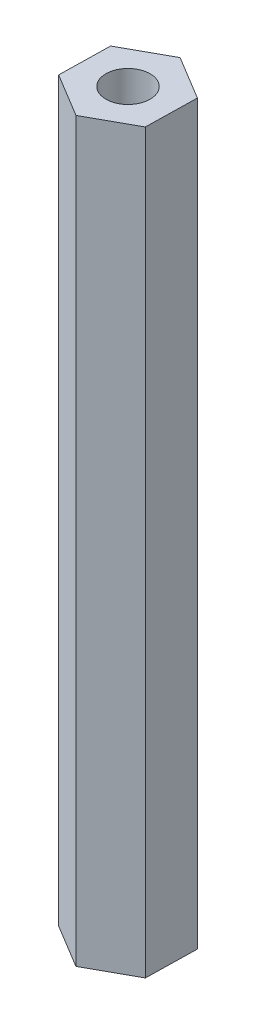
ISO-10303-21;
HEADER;
FILE_DESCRIPTION(('STEP AP214'),'2;1');
FILE_NAME('part.step','',(''),(''),'','','');
FILE_SCHEMA(('AUTOMOTIVE_DESIGN { 1 0 10303 214 1 1 1 1 }'));
ENDSEC;
DATA;
#1=APPLICATION_CONTEXT('core data for automotive mechanical design processes');
#2=APPLICATION_PROTOCOL_DEFINITION('international standard','automotive_design',2000,#1);
#3=PRODUCT_CONTEXT('',#1,'mechanical');
#4=PRODUCT('Part','Part','',(#3));
#5=PRODUCT_RELATED_PRODUCT_CATEGORY('part','',(#4));
#6=PRODUCT_DEFINITION_FORMATION('','',#4);
#7=PRODUCT_DEFINITION_CONTEXT('part definition',#1,'design');
#8=PRODUCT_DEFINITION('design','',#6,#7);
#9=PRODUCT_DEFINITION_SHAPE('','',#8);
#10=(LENGTH_UNIT() NAMED_UNIT(*) SI_UNIT(.MILLI.,.METRE.));
#11=(NAMED_UNIT(*) PLANE_ANGLE_UNIT() SI_UNIT($,.RADIAN.));
#12=(NAMED_UNIT(*) SI_UNIT($,.STERADIAN.) SOLID_ANGLE_UNIT());
#13=UNCERTAINTY_MEASURE_WITH_UNIT(LENGTH_MEASURE(1.E-05),#10,'distance_accuracy_value','');
#14=(GEOMETRIC_REPRESENTATION_CONTEXT(3) GLOBAL_UNCERTAINTY_ASSIGNED_CONTEXT((#13)) GLOBAL_UNIT_ASSIGNED_CONTEXT((#10,
#11,#12)) REPRESENTATION_CONTEXT('',''));
#15=CARTESIAN_POINT('',(0.,0.,0.));
#16=DIRECTION('',(0.,0.,1.));
#17=DIRECTION('',(1.,0.,0.));
#18=AXIS2_PLACEMENT_3D('',#15,#16,#17);
#19=CARTESIAN_POINT('',(0.,50.,0.));
#20=DIRECTION('',(0.,1.,0.));
#21=DIRECTION('',(0.,0.,1.));
#22=AXIS2_PLACEMENT_3D('',#19,#20,#21);
#23=PLANE('',#22);
#24=DIRECTION('',(0.875538817966176,0.,-0.483147780947395));
#25=VECTOR('',#24,1.);
#26=CARTESIAN_POINT('',(-0.0670343738740292,50.,3.46345295806357));
#27=LINE('',#26,#25);
#28=CARTESIAN_POINT('',(-0.0670343738740292,50.,3.46345295806357));
#29=VERTEX_POINT('',#28);
#30=CARTESIAN_POINT('',(2.9659210595584,50.,1.78977994973348));
#31=VERTEX_POINT('',#30);
#32=EDGE_CURVE('E131',#29,#31,#27,.T.);
#33=ORIENTED_EDGE('',*,*,#32,.T.);
#34=DIRECTION('',(0.0193511569005642,0.,-0.999812748831805));
#35=VECTOR('',#34,1.);
#36=CARTESIAN_POINT('',(2.9659210595584,50.,1.78977994973348));
#37=LINE('',#36,#35);
#38=CARTESIAN_POINT('',(3.03295543343243,50.,-1.67367300833009));
#39=VERTEX_POINT('',#38);
#40=EDGE_CURVE('E89',#31,#39,#37,.T.);
#41=ORIENTED_EDGE('',*,*,#40,.T.);
#42=DIRECTION('',(-0.856187661065611,0.,-0.51666496788441));
#43=VECTOR('',#42,1.);
#44=CARTESIAN_POINT('',(3.03295543343243,50.,-1.67367300833009));
#45=LINE('',#44,#43);
#46=CARTESIAN_POINT('',(0.0670343738740297,50.,-3.46345295806357));
#47=VERTEX_POINT('',#46);
#48=EDGE_CURVE('E102',#39,#47,#45,.T.);
#49=ORIENTED_EDGE('',*,*,#48,.T.);
#50=DIRECTION('',(-0.875538817966175,0.,0.483147780947395));
#51=VECTOR('',#50,1.);
#52=CARTESIAN_POINT('',(0.0670343738740297,50.,-3.46345295806357));
#53=LINE('',#52,#51);
#54=CARTESIAN_POINT('',(-2.9659210595584,50.,-1.78977994973348));
#55=VERTEX_POINT('',#54);
#56=EDGE_CURVE('E96',#47,#55,#53,.T.);
#57=ORIENTED_EDGE('',*,*,#56,.T.);
#58=DIRECTION('',(-0.0193511569005643,0.,0.999812748831805));
#59=VECTOR('',#58,1.);
#60=CARTESIAN_POINT('',(-2.9659210595584,50.,-1.78977994973348));
#61=LINE('',#60,#59);
#62=CARTESIAN_POINT('',(-3.03295543343243,50.,1.67367300833009));
#63=VERTEX_POINT('',#62);
#64=EDGE_CURVE('E100',#55,#63,#61,.T.);
#65=ORIENTED_EDGE('',*,*,#64,.T.);
#66=DIRECTION('',(0.856187661065611,0.,0.51666496788441));
#67=VECTOR('',#66,1.);
#68=CARTESIAN_POINT('',(-3.03295543343243,50.,1.67367300833009));
#69=LINE('',#68,#67);
#70=EDGE_CURVE('E52',#63,#29,#69,.T.);
#71=ORIENTED_EDGE('',*,*,#70,.T.);
#72=EDGE_LOOP('',(#33,#41,#49,#57,#65,#71));
#73=FACE_BOUND('',#72,.T.);
#74=CARTESIAN_POINT('',(0.,50.,0.));
#75=DIRECTION('',(0.,1.,0.));
#76=DIRECTION('',(0.,0.,1.));
#77=AXIS2_PLACEMENT_3D('',#74,#75,#76);
#78=CIRCLE('',#77,1.5);
#79=CARTESIAN_POINT('',(0.,50.,1.5));
#80=VERTEX_POINT('',#79);
#81=EDGE_CURVE('E124',#80,#80,#78,.T.);
#82=ORIENTED_EDGE('',*,*,#81,.F.);
#83=EDGE_LOOP('',(#82));
#84=FACE_BOUND('',#83,.T.);
#85=ADVANCED_FACE('F35',(#73,#84),#23,.T.);
#86=CARTESIAN_POINT('',(0.,0.,0.));
#87=DIRECTION('',(0.,1.,0.));
#88=DIRECTION('',(0.,0.,1.));
#89=AXIS2_PLACEMENT_3D('',#86,#87,#88);
#90=PLANE('',#89);
#91=DIRECTION('',(0.875538817966176,0.,-0.483147780947395));
#92=VECTOR('',#91,1.);
#93=CARTESIAN_POINT('',(-0.0670343738740292,0.,3.46345295806357));
#94=LINE('',#93,#92);
#95=CARTESIAN_POINT('',(-0.0670343738740292,0.,3.46345295806357));
#96=VERTEX_POINT('',#95);
#97=CARTESIAN_POINT('',(2.9659210595584,0.,1.78977994973348));
#98=VERTEX_POINT('',#97);
#99=EDGE_CURVE('E120',#96,#98,#94,.T.);
#100=ORIENTED_EDGE('',*,*,#99,.F.);
#101=DIRECTION('',(0.856187661065611,0.,0.51666496788441));
#102=VECTOR('',#101,1.);
#103=CARTESIAN_POINT('',(-3.03295543343243,0.,1.67367300833009));
#104=LINE('',#103,#102);
#105=CARTESIAN_POINT('',(-3.03295543343243,0.,1.67367300833009));
#106=VERTEX_POINT('',#105);
#107=EDGE_CURVE('E81',#106,#96,#104,.T.);
#108=ORIENTED_EDGE('',*,*,#107,.F.);
#109=DIRECTION('',(-0.0193511569005643,0.,0.999812748831805));
#110=VECTOR('',#109,1.);
#111=CARTESIAN_POINT('',(-2.9659210595584,0.,-1.78977994973348));
#112=LINE('',#111,#110);
#113=CARTESIAN_POINT('',(-2.9659210595584,0.,-1.78977994973348));
#114=VERTEX_POINT('',#113);
#115=EDGE_CURVE('E75',#114,#106,#112,.T.);
#116=ORIENTED_EDGE('',*,*,#115,.F.);
#117=DIRECTION('',(-0.875538817966175,0.,0.483147780947395));
#118=VECTOR('',#117,1.);
#119=CARTESIAN_POINT('',(0.0670343738740297,0.,-3.46345295806357));
#120=LINE('',#119,#118);
#121=CARTESIAN_POINT('',(0.0670343738740297,0.,-3.46345295806357));
#122=VERTEX_POINT('',#121);
#123=EDGE_CURVE('E110',#122,#114,#120,.T.);
#124=ORIENTED_EDGE('',*,*,#123,.F.);
#125=DIRECTION('',(-0.856187661065611,0.,-0.51666496788441));
#126=VECTOR('',#125,1.);
#127=CARTESIAN_POINT('',(3.03295543343243,0.,-1.67367300833009));
#128=LINE('',#127,#126);
#129=CARTESIAN_POINT('',(3.03295543343243,0.,-1.67367300833009));
#130=VERTEX_POINT('',#129);
#131=EDGE_CURVE('E126',#130,#122,#128,.T.);
#132=ORIENTED_EDGE('',*,*,#131,.F.);
#133=DIRECTION('',(0.0193511569005642,0.,-0.999812748831805));
#134=VECTOR('',#133,1.);
#135=CARTESIAN_POINT('',(2.9659210595584,0.,1.78977994973348));
#136=LINE('',#135,#134);
#137=EDGE_CURVE('E123',#98,#130,#136,.T.);
#138=ORIENTED_EDGE('',*,*,#137,.F.);
#139=EDGE_LOOP('',(#100,#108,#116,#124,#132,#138));
#140=FACE_BOUND('',#139,.T.);
#141=CARTESIAN_POINT('',(0.,0.,0.));
#142=DIRECTION('',(0.,1.,0.));
#143=DIRECTION('',(0.,0.,1.));
#144=AXIS2_PLACEMENT_3D('',#141,#142,#143);
#145=CIRCLE('',#144,1.5);
#146=CARTESIAN_POINT('',(0.,0.,1.5));
#147=VERTEX_POINT('',#146);
#148=EDGE_CURVE('E224',#147,#147,#145,.T.);
#149=ORIENTED_EDGE('',*,*,#148,.T.);
#150=EDGE_LOOP('',(#149));
#151=FACE_BOUND('',#150,.T.);
#152=ADVANCED_FACE('F140',(#140,#151),#90,.F.);
#153=CARTESIAN_POINT('',(-0.0670343738740292,50.,3.46345295806357));
#154=DIRECTION('',(-0.483147780947395,0.,-0.875538817966176));
#155=DIRECTION('',(-0.875538817966176,0.,0.483147780947395));
#156=AXIS2_PLACEMENT_3D('',#153,#154,#155);
#157=PLANE('',#156);
#158=ORIENTED_EDGE('',*,*,#99,.T.);
#159=DIRECTION('',(0.,-1.,0.));
#160=VECTOR('',#159,1.);
#161=CARTESIAN_POINT('',(2.9659210595584,50.,1.78977994973348));
#162=LINE('',#161,#160);
#163=EDGE_CURVE('E11',#31,#98,#162,.T.);
#164=ORIENTED_EDGE('',*,*,#163,.F.);
#165=ORIENTED_EDGE('',*,*,#32,.F.);
#166=DIRECTION('',(0.,-1.,0.));
#167=VECTOR('',#166,1.);
#168=CARTESIAN_POINT('',(-0.0670343738740292,50.,3.46345295806357));
#169=LINE('',#168,#167);
#170=EDGE_CURVE('E116',#29,#96,#169,.T.);
#171=ORIENTED_EDGE('',*,*,#170,.T.);
#172=EDGE_LOOP('',(#158,#164,#165,#171));
#173=FACE_BOUND('',#172,.T.);
#174=ADVANCED_FACE('F37',(#173),#157,.F.);
#175=CARTESIAN_POINT('',(2.9659210595584,50.,1.78977994973348));
#176=DIRECTION('',(-0.999812748831805,0.,-0.0193511569005642));
#177=DIRECTION('',(-0.0193511569005642,0.,0.999812748831805));
#178=AXIS2_PLACEMENT_3D('',#175,#176,#177);
#179=PLANE('',#178);
#180=ORIENTED_EDGE('',*,*,#137,.T.);
#181=DIRECTION('',(0.,-1.,0.));
#182=VECTOR('',#181,1.);
#183=CARTESIAN_POINT('',(3.03295543343243,50.,-1.67367300833009));
#184=LINE('',#183,#182);
#185=EDGE_CURVE('E44',#39,#130,#184,.T.);
#186=ORIENTED_EDGE('',*,*,#185,.F.);
#187=ORIENTED_EDGE('',*,*,#40,.F.);
#188=ORIENTED_EDGE('',*,*,#163,.T.);
#189=EDGE_LOOP('',(#180,#186,#187,#188));
#190=FACE_BOUND('',#189,.T.);
#191=ADVANCED_FACE('F165',(#190),#179,.F.);
#192=CARTESIAN_POINT('',(3.03295543343243,50.,-1.67367300833009));
#193=DIRECTION('',(-0.51666496788441,0.,0.856187661065611));
#194=DIRECTION('',(0.856187661065611,0.,0.51666496788441));
#195=AXIS2_PLACEMENT_3D('',#192,#193,#194);
#196=PLANE('',#195);
#197=ORIENTED_EDGE('',*,*,#131,.T.);
#198=DIRECTION('',(0.,-1.,0.));
#199=VECTOR('',#198,1.);
#200=CARTESIAN_POINT('',(0.0670343738740297,50.,-3.46345295806357));
#201=LINE('',#200,#199);
#202=EDGE_CURVE('E111',#47,#122,#201,.T.);
#203=ORIENTED_EDGE('',*,*,#202,.F.);
#204=ORIENTED_EDGE('',*,*,#48,.F.);
#205=ORIENTED_EDGE('',*,*,#185,.T.);
#206=EDGE_LOOP('',(#197,#203,#204,#205));
#207=FACE_BOUND('',#206,.T.);
#208=ADVANCED_FACE('F137',(#207),#196,.F.);
#209=CARTESIAN_POINT('',(0.0670343738740297,50.,-3.46345295806357));
#210=DIRECTION('',(0.483147780947395,0.,0.875538817966175));
#211=DIRECTION('',(0.875538817966176,0.,-0.483147780947395));
#212=AXIS2_PLACEMENT_3D('',#209,#210,#211);
#213=PLANE('',#212);
#214=ORIENTED_EDGE('',*,*,#123,.T.);
#215=DIRECTION('',(0.,-1.,0.));
#216=VECTOR('',#215,1.);
#217=CARTESIAN_POINT('',(-2.9659210595584,50.,-1.78977994973348));
#218=LINE('',#217,#216);
#219=EDGE_CURVE('E107',#55,#114,#218,.T.);
#220=ORIENTED_EDGE('',*,*,#219,.F.);
#221=ORIENTED_EDGE('',*,*,#56,.F.);
#222=ORIENTED_EDGE('',*,*,#202,.T.);
#223=EDGE_LOOP('',(#214,#220,#221,#222));
#224=FACE_BOUND('',#223,.T.);
#225=ADVANCED_FACE('F108',(#224),#213,.F.);
#226=CARTESIAN_POINT('',(-2.9659210595584,50.,-1.78977994973348));
#227=DIRECTION('',(0.999812748831805,0.,0.0193511569005643));
#228=DIRECTION('',(0.0193511569005644,0.,-0.999812748831805));
#229=AXIS2_PLACEMENT_3D('',#226,#227,#228);
#230=PLANE('',#229);
#231=ORIENTED_EDGE('',*,*,#115,.T.);
#232=DIRECTION('',(0.,-1.,0.));
#233=VECTOR('',#232,1.);
#234=CARTESIAN_POINT('',(-3.03295543343243,50.,1.67367300833009));
#235=LINE('',#234,#233);
#236=EDGE_CURVE('E112',#63,#106,#235,.T.);
#237=ORIENTED_EDGE('',*,*,#236,.F.);
#238=ORIENTED_EDGE('',*,*,#64,.F.);
#239=ORIENTED_EDGE('',*,*,#219,.T.);
#240=EDGE_LOOP('',(#231,#237,#238,#239));
#241=FACE_BOUND('',#240,.T.);
#242=ADVANCED_FACE('F114',(#241),#230,.F.);
#243=CARTESIAN_POINT('',(-3.03295543343243,50.,1.67367300833009));
#244=DIRECTION('',(0.51666496788441,0.,-0.856187661065611));
#245=DIRECTION('',(-0.856187661065611,0.,-0.51666496788441));
#246=AXIS2_PLACEMENT_3D('',#243,#244,#245);
#247=PLANE('',#246);
#248=ORIENTED_EDGE('',*,*,#107,.T.);
#249=ORIENTED_EDGE('',*,*,#170,.F.);
#250=ORIENTED_EDGE('',*,*,#70,.F.);
#251=ORIENTED_EDGE('',*,*,#236,.T.);
#252=EDGE_LOOP('',(#248,#249,#250,#251));
#253=FACE_BOUND('',#252,.T.);
#254=ADVANCED_FACE('F145',(#253),#247,.F.);
#255=CARTESIAN_POINT('',(0.,50.,0.));
#256=DIRECTION('',(0.,-1.,0.));
#257=DIRECTION('',(0.,0.,-1.));
#258=AXIS2_PLACEMENT_3D('',#255,#256,#257);
#259=CYLINDRICAL_SURFACE('',#258,1.5);
#260=ORIENTED_EDGE('',*,*,#81,.T.);
#261=EDGE_LOOP('',(#260));
#262=FACE_BOUND('',#261,.T.);
#263=ORIENTED_EDGE('',*,*,#148,.F.);
#264=EDGE_LOOP('',(#263));
#265=FACE_BOUND('',#264,.T.);
#266=ADVANCED_FACE('F147',(#262,#265),#259,.F.);
#267=CLOSED_SHELL('',(#85,#152,#174,#191,#208,#225,#242,#254,#266));
#268=MANIFOLD_SOLID_BREP('B2',#267);
#269=ADVANCED_BREP_SHAPE_REPRESENTATION('',(#18,#268),#14);
#270=SHAPE_DEFINITION_REPRESENTATION(#9,#269);
ENDSEC;
END-ISO-10303-21;
